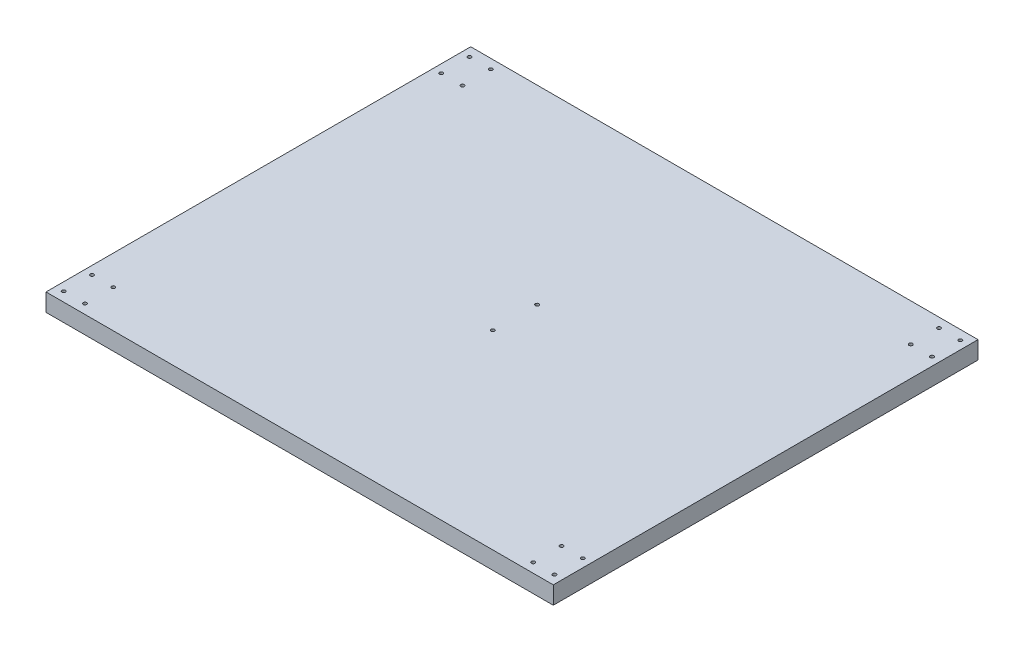
ISO-10303-21;
HEADER;
FILE_DESCRIPTION(('STEP AP214'),'2;1');
FILE_NAME('part.step','',(''),(''),'','','');
FILE_SCHEMA(('AUTOMOTIVE_DESIGN { 1 0 10303 214 1 1 1 1 }'));
ENDSEC;
DATA;
#1=APPLICATION_CONTEXT('core data for automotive mechanical design processes');
#2=APPLICATION_PROTOCOL_DEFINITION('international standard','automotive_design',2000,#1);
#3=PRODUCT_CONTEXT('',#1,'mechanical');
#4=PRODUCT('Part','Part','',(#3));
#5=PRODUCT_RELATED_PRODUCT_CATEGORY('part','',(#4));
#6=PRODUCT_DEFINITION_FORMATION('','',#4);
#7=PRODUCT_DEFINITION_CONTEXT('part definition',#1,'design');
#8=PRODUCT_DEFINITION('design','',#6,#7);
#9=PRODUCT_DEFINITION_SHAPE('','',#8);
#10=(LENGTH_UNIT() NAMED_UNIT(*) SI_UNIT(.MILLI.,.METRE.));
#11=(NAMED_UNIT(*) PLANE_ANGLE_UNIT() SI_UNIT($,.RADIAN.));
#12=(NAMED_UNIT(*) SI_UNIT($,.STERADIAN.) SOLID_ANGLE_UNIT());
#13=UNCERTAINTY_MEASURE_WITH_UNIT(LENGTH_MEASURE(1.E-05),#10,'distance_accuracy_value','');
#14=(GEOMETRIC_REPRESENTATION_CONTEXT(3) GLOBAL_UNCERTAINTY_ASSIGNED_CONTEXT((#13)) GLOBAL_UNIT_ASSIGNED_CONTEXT((#10,
#11,#12)) REPRESENTATION_CONTEXT('',''));
#15=CARTESIAN_POINT('',(0.,0.,0.));
#16=DIRECTION('',(0.,0.,1.));
#17=DIRECTION('',(1.,0.,0.));
#18=AXIS2_PLACEMENT_3D('',#15,#16,#17);
#19=CARTESIAN_POINT('',(0.,15.,0.));
#20=DIRECTION('',(0.,-1.,0.));
#21=DIRECTION('',(0.,0.,-1.));
#22=AXIS2_PLACEMENT_3D('',#19,#20,#21);
#23=PLANE('',#22);
#24=CARTESIAN_POINT('',(208.,15.,-148.));
#25=DIRECTION('',(0.,1.,0.));
#26=DIRECTION('',(0.,0.,-1.));
#27=AXIS2_PLACEMENT_3D('',#24,#25,#26);
#28=CIRCLE('',#27,1.5);
#29=CARTESIAN_POINT('',(208.,15.,-149.5));
#30=VERTEX_POINT('',#29);
#31=EDGE_CURVE('E214',#30,#30,#28,.T.);
#32=ORIENTED_EDGE('',*,*,#31,.F.);
#33=EDGE_LOOP('',(#32));
#34=FACE_BOUND('',#33,.T.);
#35=CARTESIAN_POINT('',(190.,15.,-148.));
#36=DIRECTION('',(0.,1.,0.));
#37=DIRECTION('',(0.,0.,-1.));
#38=AXIS2_PLACEMENT_3D('',#35,#36,#37);
#39=CIRCLE('',#38,1.5);
#40=CARTESIAN_POINT('',(190.,15.,-149.5));
#41=VERTEX_POINT('',#40);
#42=EDGE_CURVE('E208',#41,#41,#39,.T.);
#43=ORIENTED_EDGE('',*,*,#42,.F.);
#44=EDGE_LOOP('',(#43));
#45=FACE_BOUND('',#44,.T.);
#46=CARTESIAN_POINT('',(190.,15.,-172.));
#47=DIRECTION('',(0.,1.,0.));
#48=DIRECTION('',(0.,0.,-1.));
#49=AXIS2_PLACEMENT_3D('',#46,#47,#48);
#50=CIRCLE('',#49,1.5);
#51=CARTESIAN_POINT('',(190.,15.,-173.5));
#52=VERTEX_POINT('',#51);
#53=EDGE_CURVE('E202',#52,#52,#50,.T.);
#54=ORIENTED_EDGE('',*,*,#53,.F.);
#55=EDGE_LOOP('',(#54));
#56=FACE_BOUND('',#55,.T.);
#57=CARTESIAN_POINT('',(208.,15.,-172.));
#58=DIRECTION('',(0.,1.,0.));
#59=DIRECTION('',(0.,0.,-1.));
#60=AXIS2_PLACEMENT_3D('',#57,#58,#59);
#61=CIRCLE('',#60,1.5);
#62=CARTESIAN_POINT('',(208.,15.,-173.5));
#63=VERTEX_POINT('',#62);
#64=EDGE_CURVE('E196',#63,#63,#61,.T.);
#65=ORIENTED_EDGE('',*,*,#64,.F.);
#66=EDGE_LOOP('',(#65));
#67=FACE_BOUND('',#66,.T.);
#68=CARTESIAN_POINT('',(-208.,15.,-148.));
#69=DIRECTION('',(0.,1.,0.));
#70=DIRECTION('',(0.,0.,1.));
#71=AXIS2_PLACEMENT_3D('',#68,#69,#70);
#72=CIRCLE('',#71,1.5);
#73=CARTESIAN_POINT('',(-208.,15.,-146.5));
#74=VERTEX_POINT('',#73);
#75=EDGE_CURVE('E190',#74,#74,#72,.T.);
#76=ORIENTED_EDGE('',*,*,#75,.F.);
#77=EDGE_LOOP('',(#76));
#78=FACE_BOUND('',#77,.T.);
#79=CARTESIAN_POINT('',(-190.,15.,-148.));
#80=DIRECTION('',(0.,1.,0.));
#81=DIRECTION('',(0.,0.,1.));
#82=AXIS2_PLACEMENT_3D('',#79,#80,#81);
#83=CIRCLE('',#82,1.5);
#84=CARTESIAN_POINT('',(-190.,15.,-146.5));
#85=VERTEX_POINT('',#84);
#86=EDGE_CURVE('E184',#85,#85,#83,.T.);
#87=ORIENTED_EDGE('',*,*,#86,.F.);
#88=EDGE_LOOP('',(#87));
#89=FACE_BOUND('',#88,.T.);
#90=CARTESIAN_POINT('',(-190.,15.,-172.));
#91=DIRECTION('',(0.,1.,0.));
#92=DIRECTION('',(0.,0.,1.));
#93=AXIS2_PLACEMENT_3D('',#90,#91,#92);
#94=CIRCLE('',#93,1.5);
#95=CARTESIAN_POINT('',(-190.,15.,-170.5));
#96=VERTEX_POINT('',#95);
#97=EDGE_CURVE('E178',#96,#96,#94,.T.);
#98=ORIENTED_EDGE('',*,*,#97,.F.);
#99=EDGE_LOOP('',(#98));
#100=FACE_BOUND('',#99,.T.);
#101=CARTESIAN_POINT('',(-208.,15.,-172.));
#102=DIRECTION('',(0.,1.,0.));
#103=DIRECTION('',(0.,0.,1.));
#104=AXIS2_PLACEMENT_3D('',#101,#102,#103);
#105=CIRCLE('',#104,1.5);
#106=CARTESIAN_POINT('',(-208.,15.,-170.5));
#107=VERTEX_POINT('',#106);
#108=EDGE_CURVE('E172',#107,#107,#105,.T.);
#109=ORIENTED_EDGE('',*,*,#108,.F.);
#110=EDGE_LOOP('',(#109));
#111=FACE_BOUND('',#110,.T.);
#112=CARTESIAN_POINT('',(-190.,15.,148.));
#113=DIRECTION('',(0.,1.,0.));
#114=DIRECTION('',(0.,0.,-1.));
#115=AXIS2_PLACEMENT_3D('',#112,#113,#114);
#116=CIRCLE('',#115,1.5);
#117=CARTESIAN_POINT('',(-190.,15.,146.5));
#118=VERTEX_POINT('',#117);
#119=EDGE_CURVE('E166',#118,#118,#116,.T.);
#120=ORIENTED_EDGE('',*,*,#119,.F.);
#121=EDGE_LOOP('',(#120));
#122=FACE_BOUND('',#121,.T.);
#123=CARTESIAN_POINT('',(-208.,15.,148.));
#124=DIRECTION('',(0.,1.,0.));
#125=DIRECTION('',(0.,0.,-1.));
#126=AXIS2_PLACEMENT_3D('',#123,#124,#125);
#127=CIRCLE('',#126,1.5);
#128=CARTESIAN_POINT('',(-208.,15.,146.5));
#129=VERTEX_POINT('',#128);
#130=EDGE_CURVE('E160',#129,#129,#127,.T.);
#131=ORIENTED_EDGE('',*,*,#130,.F.);
#132=EDGE_LOOP('',(#131));
#133=FACE_BOUND('',#132,.T.);
#134=CARTESIAN_POINT('',(-190.,15.,172.));
#135=DIRECTION('',(0.,1.,0.));
#136=DIRECTION('',(0.,0.,-1.));
#137=AXIS2_PLACEMENT_3D('',#134,#135,#136);
#138=CIRCLE('',#137,1.5);
#139=CARTESIAN_POINT('',(-190.,15.,170.5));
#140=VERTEX_POINT('',#139);
#141=EDGE_CURVE('E154',#140,#140,#138,.T.);
#142=ORIENTED_EDGE('',*,*,#141,.F.);
#143=EDGE_LOOP('',(#142));
#144=FACE_BOUND('',#143,.T.);
#145=CARTESIAN_POINT('',(-208.,15.,172.));
#146=DIRECTION('',(0.,1.,0.));
#147=DIRECTION('',(0.,0.,-1.));
#148=AXIS2_PLACEMENT_3D('',#145,#146,#147);
#149=CIRCLE('',#148,1.5);
#150=CARTESIAN_POINT('',(-208.,15.,170.5));
#151=VERTEX_POINT('',#150);
#152=EDGE_CURVE('E148',#151,#151,#149,.T.);
#153=ORIENTED_EDGE('',*,*,#152,.F.);
#154=EDGE_LOOP('',(#153));
#155=FACE_BOUND('',#154,.T.);
#156=CARTESIAN_POINT('',(208.,15.,148.));
#157=DIRECTION('',(0.,1.,0.));
#158=DIRECTION('',(0.,0.,1.));
#159=AXIS2_PLACEMENT_3D('',#156,#157,#158);
#160=CIRCLE('',#159,1.5);
#161=CARTESIAN_POINT('',(208.,15.,149.5));
#162=VERTEX_POINT('',#161);
#163=EDGE_CURVE('E142',#162,#162,#160,.T.);
#164=ORIENTED_EDGE('',*,*,#163,.F.);
#165=EDGE_LOOP('',(#164));
#166=FACE_BOUND('',#165,.T.);
#167=CARTESIAN_POINT('',(190.,15.,148.));
#168=DIRECTION('',(0.,1.,0.));
#169=DIRECTION('',(0.,0.,1.));
#170=AXIS2_PLACEMENT_3D('',#167,#168,#169);
#171=CIRCLE('',#170,1.5);
#172=CARTESIAN_POINT('',(190.,15.,149.5));
#173=VERTEX_POINT('',#172);
#174=EDGE_CURVE('E136',#173,#173,#171,.T.);
#175=ORIENTED_EDGE('',*,*,#174,.F.);
#176=EDGE_LOOP('',(#175));
#177=FACE_BOUND('',#176,.T.);
#178=CARTESIAN_POINT('',(190.,15.,172.));
#179=DIRECTION('',(0.,1.,0.));
#180=DIRECTION('',(0.,0.,1.));
#181=AXIS2_PLACEMENT_3D('',#178,#179,#180);
#182=CIRCLE('',#181,1.5);
#183=CARTESIAN_POINT('',(190.,15.,173.5));
#184=VERTEX_POINT('',#183);
#185=EDGE_CURVE('E130',#184,#184,#182,.T.);
#186=ORIENTED_EDGE('',*,*,#185,.F.);
#187=EDGE_LOOP('',(#186));
#188=FACE_BOUND('',#187,.T.);
#189=CARTESIAN_POINT('',(208.,15.,172.));
#190=DIRECTION('',(0.,1.,0.));
#191=DIRECTION('',(0.,0.,1.));
#192=AXIS2_PLACEMENT_3D('',#189,#190,#191);
#193=CIRCLE('',#192,1.5);
#194=CARTESIAN_POINT('',(208.,15.,173.5));
#195=VERTEX_POINT('',#194);
#196=EDGE_CURVE('E124',#195,#195,#193,.T.);
#197=ORIENTED_EDGE('',*,*,#196,.F.);
#198=EDGE_LOOP('',(#197));
#199=FACE_BOUND('',#198,.T.);
#200=CARTESIAN_POINT('',(2.5,15.,-18.8));
#201=DIRECTION('',(0.,1.,0.));
#202=DIRECTION('',(0.,0.,1.));
#203=AXIS2_PLACEMENT_3D('',#200,#201,#202);
#204=CIRCLE('',#203,1.5);
#205=CARTESIAN_POINT('',(2.5,15.,-17.3));
#206=VERTEX_POINT('',#205);
#207=EDGE_CURVE('E100',#206,#206,#204,.T.);
#208=ORIENTED_EDGE('',*,*,#207,.F.);
#209=EDGE_LOOP('',(#208));
#210=FACE_BOUND('',#209,.T.);
#211=DIRECTION('',(0.,0.,-1.));
#212=VECTOR('',#211,1.);
#213=CARTESIAN_POINT('',(215.,15.,180.));
#214=LINE('',#213,#212);
#215=CARTESIAN_POINT('',(215.,15.,180.));
#216=VERTEX_POINT('',#215);
#217=CARTESIAN_POINT('',(215.,15.,-180.));
#218=VERTEX_POINT('',#217);
#219=EDGE_CURVE('E85',#216,#218,#214,.T.);
#220=ORIENTED_EDGE('',*,*,#219,.T.);
#221=DIRECTION('',(-1.,0.,0.));
#222=VECTOR('',#221,1.);
#223=CARTESIAN_POINT('',(-215.,15.,-180.));
#224=LINE('',#223,#222);
#225=CARTESIAN_POINT('',(-215.,15.,-180.));
#226=VERTEX_POINT('',#225);
#227=EDGE_CURVE('E80',#218,#226,#224,.T.);
#228=ORIENTED_EDGE('',*,*,#227,.T.);
#229=DIRECTION('',(0.,0.,1.));
#230=VECTOR('',#229,1.);
#231=CARTESIAN_POINT('',(-215.,15.,180.));
#232=LINE('',#231,#230);
#233=CARTESIAN_POINT('',(-215.,15.,180.));
#234=VERTEX_POINT('',#233);
#235=EDGE_CURVE('E83',#226,#234,#232,.T.);
#236=ORIENTED_EDGE('',*,*,#235,.T.);
#237=DIRECTION('',(1.,0.,0.));
#238=VECTOR('',#237,1.);
#239=CARTESIAN_POINT('',(-215.,15.,180.));
#240=LINE('',#239,#238);
#241=EDGE_CURVE('E50',#234,#216,#240,.T.);
#242=ORIENTED_EDGE('',*,*,#241,.T.);
#243=EDGE_LOOP('',(#220,#228,#236,#242));
#244=FACE_BOUND('',#243,.T.);
#245=CARTESIAN_POINT('',(2.5,15.,18.8));
#246=DIRECTION('',(0.,1.,0.));
#247=DIRECTION('',(0.,0.,1.));
#248=AXIS2_PLACEMENT_3D('',#245,#246,#247);
#249=CIRCLE('',#248,1.5);
#250=CARTESIAN_POINT('',(2.5,15.,20.3));
#251=VERTEX_POINT('',#250);
#252=EDGE_CURVE('E115',#251,#251,#249,.T.);
#253=ORIENTED_EDGE('',*,*,#252,.F.);
#254=EDGE_LOOP('',(#253));
#255=FACE_BOUND('',#254,.T.);
#256=ADVANCED_FACE('F33',(#34,#45,#56,#67,#78,#89,#100,#111,#122,#133,#144,#155,#166,#177,#188,
#199,#210,#244,#255),#23,.F.);
#257=CARTESIAN_POINT('',(0.,0.,0.));
#258=DIRECTION('',(0.,-1.,0.));
#259=DIRECTION('',(0.,0.,-1.));
#260=AXIS2_PLACEMENT_3D('',#257,#258,#259);
#261=PLANE('',#260);
#262=CARTESIAN_POINT('',(208.,0.,-148.));
#263=DIRECTION('',(0.,1.,0.));
#264=DIRECTION('',(0.,0.,-1.));
#265=AXIS2_PLACEMENT_3D('',#262,#263,#264);
#266=CIRCLE('',#265,1.5);
#267=CARTESIAN_POINT('',(208.,0.,-149.5));
#268=VERTEX_POINT('',#267);
#269=EDGE_CURVE('E211',#268,#268,#266,.T.);
#270=ORIENTED_EDGE('',*,*,#269,.T.);
#271=EDGE_LOOP('',(#270));
#272=FACE_BOUND('',#271,.T.);
#273=CARTESIAN_POINT('',(190.,0.,-148.));
#274=DIRECTION('',(0.,1.,0.));
#275=DIRECTION('',(0.,0.,-1.));
#276=AXIS2_PLACEMENT_3D('',#273,#274,#275);
#277=CIRCLE('',#276,1.5);
#278=CARTESIAN_POINT('',(190.,0.,-149.5));
#279=VERTEX_POINT('',#278);
#280=EDGE_CURVE('E205',#279,#279,#277,.T.);
#281=ORIENTED_EDGE('',*,*,#280,.T.);
#282=EDGE_LOOP('',(#281));
#283=FACE_BOUND('',#282,.T.);
#284=CARTESIAN_POINT('',(190.,0.,-172.));
#285=DIRECTION('',(0.,1.,0.));
#286=DIRECTION('',(0.,0.,-1.));
#287=AXIS2_PLACEMENT_3D('',#284,#285,#286);
#288=CIRCLE('',#287,1.5);
#289=CARTESIAN_POINT('',(190.,0.,-173.5));
#290=VERTEX_POINT('',#289);
#291=EDGE_CURVE('E199',#290,#290,#288,.T.);
#292=ORIENTED_EDGE('',*,*,#291,.T.);
#293=EDGE_LOOP('',(#292));
#294=FACE_BOUND('',#293,.T.);
#295=CARTESIAN_POINT('',(208.,0.,-172.));
#296=DIRECTION('',(0.,1.,0.));
#297=DIRECTION('',(0.,0.,-1.));
#298=AXIS2_PLACEMENT_3D('',#295,#296,#297);
#299=CIRCLE('',#298,1.5);
#300=CARTESIAN_POINT('',(208.,0.,-173.5));
#301=VERTEX_POINT('',#300);
#302=EDGE_CURVE('E193',#301,#301,#299,.T.);
#303=ORIENTED_EDGE('',*,*,#302,.T.);
#304=EDGE_LOOP('',(#303));
#305=FACE_BOUND('',#304,.T.);
#306=CARTESIAN_POINT('',(-208.,0.,-148.));
#307=DIRECTION('',(0.,1.,0.));
#308=DIRECTION('',(0.,0.,1.));
#309=AXIS2_PLACEMENT_3D('',#306,#307,#308);
#310=CIRCLE('',#309,1.5);
#311=CARTESIAN_POINT('',(-208.,0.,-146.5));
#312=VERTEX_POINT('',#311);
#313=EDGE_CURVE('E187',#312,#312,#310,.T.);
#314=ORIENTED_EDGE('',*,*,#313,.T.);
#315=EDGE_LOOP('',(#314));
#316=FACE_BOUND('',#315,.T.);
#317=CARTESIAN_POINT('',(-190.,0.,-148.));
#318=DIRECTION('',(0.,1.,0.));
#319=DIRECTION('',(0.,0.,1.));
#320=AXIS2_PLACEMENT_3D('',#317,#318,#319);
#321=CIRCLE('',#320,1.5);
#322=CARTESIAN_POINT('',(-190.,0.,-146.5));
#323=VERTEX_POINT('',#322);
#324=EDGE_CURVE('E181',#323,#323,#321,.T.);
#325=ORIENTED_EDGE('',*,*,#324,.T.);
#326=EDGE_LOOP('',(#325));
#327=FACE_BOUND('',#326,.T.);
#328=CARTESIAN_POINT('',(-190.,0.,-172.));
#329=DIRECTION('',(0.,1.,0.));
#330=DIRECTION('',(0.,0.,1.));
#331=AXIS2_PLACEMENT_3D('',#328,#329,#330);
#332=CIRCLE('',#331,1.5);
#333=CARTESIAN_POINT('',(-190.,0.,-170.5));
#334=VERTEX_POINT('',#333);
#335=EDGE_CURVE('E175',#334,#334,#332,.T.);
#336=ORIENTED_EDGE('',*,*,#335,.T.);
#337=EDGE_LOOP('',(#336));
#338=FACE_BOUND('',#337,.T.);
#339=CARTESIAN_POINT('',(-208.,0.,-172.));
#340=DIRECTION('',(0.,1.,0.));
#341=DIRECTION('',(0.,0.,1.));
#342=AXIS2_PLACEMENT_3D('',#339,#340,#341);
#343=CIRCLE('',#342,1.5);
#344=CARTESIAN_POINT('',(-208.,0.,-170.5));
#345=VERTEX_POINT('',#344);
#346=EDGE_CURVE('E169',#345,#345,#343,.T.);
#347=ORIENTED_EDGE('',*,*,#346,.T.);
#348=EDGE_LOOP('',(#347));
#349=FACE_BOUND('',#348,.T.);
#350=CARTESIAN_POINT('',(-190.,0.,148.));
#351=DIRECTION('',(0.,1.,0.));
#352=DIRECTION('',(0.,0.,-1.));
#353=AXIS2_PLACEMENT_3D('',#350,#351,#352);
#354=CIRCLE('',#353,1.5);
#355=CARTESIAN_POINT('',(-190.,0.,146.5));
#356=VERTEX_POINT('',#355);
#357=EDGE_CURVE('E163',#356,#356,#354,.T.);
#358=ORIENTED_EDGE('',*,*,#357,.T.);
#359=EDGE_LOOP('',(#358));
#360=FACE_BOUND('',#359,.T.);
#361=CARTESIAN_POINT('',(-208.,0.,148.));
#362=DIRECTION('',(0.,1.,0.));
#363=DIRECTION('',(0.,0.,-1.));
#364=AXIS2_PLACEMENT_3D('',#361,#362,#363);
#365=CIRCLE('',#364,1.5);
#366=CARTESIAN_POINT('',(-208.,0.,146.5));
#367=VERTEX_POINT('',#366);
#368=EDGE_CURVE('E157',#367,#367,#365,.T.);
#369=ORIENTED_EDGE('',*,*,#368,.T.);
#370=EDGE_LOOP('',(#369));
#371=FACE_BOUND('',#370,.T.);
#372=CARTESIAN_POINT('',(-190.,0.,172.));
#373=DIRECTION('',(0.,1.,0.));
#374=DIRECTION('',(0.,0.,-1.));
#375=AXIS2_PLACEMENT_3D('',#372,#373,#374);
#376=CIRCLE('',#375,1.5);
#377=CARTESIAN_POINT('',(-190.,0.,170.5));
#378=VERTEX_POINT('',#377);
#379=EDGE_CURVE('E151',#378,#378,#376,.T.);
#380=ORIENTED_EDGE('',*,*,#379,.T.);
#381=EDGE_LOOP('',(#380));
#382=FACE_BOUND('',#381,.T.);
#383=CARTESIAN_POINT('',(-208.,0.,172.));
#384=DIRECTION('',(0.,1.,0.));
#385=DIRECTION('',(0.,0.,-1.));
#386=AXIS2_PLACEMENT_3D('',#383,#384,#385);
#387=CIRCLE('',#386,1.5);
#388=CARTESIAN_POINT('',(-208.,0.,170.5));
#389=VERTEX_POINT('',#388);
#390=EDGE_CURVE('E145',#389,#389,#387,.T.);
#391=ORIENTED_EDGE('',*,*,#390,.T.);
#392=EDGE_LOOP('',(#391));
#393=FACE_BOUND('',#392,.T.);
#394=CARTESIAN_POINT('',(208.,0.,148.));
#395=DIRECTION('',(0.,1.,0.));
#396=DIRECTION('',(0.,0.,1.));
#397=AXIS2_PLACEMENT_3D('',#394,#395,#396);
#398=CIRCLE('',#397,1.5);
#399=CARTESIAN_POINT('',(208.,0.,149.5));
#400=VERTEX_POINT('',#399);
#401=EDGE_CURVE('E139',#400,#400,#398,.T.);
#402=ORIENTED_EDGE('',*,*,#401,.T.);
#403=EDGE_LOOP('',(#402));
#404=FACE_BOUND('',#403,.T.);
#405=CARTESIAN_POINT('',(190.,0.,148.));
#406=DIRECTION('',(0.,1.,0.));
#407=DIRECTION('',(0.,0.,1.));
#408=AXIS2_PLACEMENT_3D('',#405,#406,#407);
#409=CIRCLE('',#408,1.5);
#410=CARTESIAN_POINT('',(190.,0.,149.5));
#411=VERTEX_POINT('',#410);
#412=EDGE_CURVE('E133',#411,#411,#409,.T.);
#413=ORIENTED_EDGE('',*,*,#412,.T.);
#414=EDGE_LOOP('',(#413));
#415=FACE_BOUND('',#414,.T.);
#416=CARTESIAN_POINT('',(190.,0.,172.));
#417=DIRECTION('',(0.,1.,0.));
#418=DIRECTION('',(0.,0.,1.));
#419=AXIS2_PLACEMENT_3D('',#416,#417,#418);
#420=CIRCLE('',#419,1.5);
#421=CARTESIAN_POINT('',(190.,0.,173.5));
#422=VERTEX_POINT('',#421);
#423=EDGE_CURVE('E127',#422,#422,#420,.T.);
#424=ORIENTED_EDGE('',*,*,#423,.T.);
#425=EDGE_LOOP('',(#424));
#426=FACE_BOUND('',#425,.T.);
#427=CARTESIAN_POINT('',(208.,0.,172.));
#428=DIRECTION('',(0.,1.,0.));
#429=DIRECTION('',(0.,0.,1.));
#430=AXIS2_PLACEMENT_3D('',#427,#428,#429);
#431=CIRCLE('',#430,1.5);
#432=CARTESIAN_POINT('',(208.,0.,173.5));
#433=VERTEX_POINT('',#432);
#434=EDGE_CURVE('E121',#433,#433,#431,.T.);
#435=ORIENTED_EDGE('',*,*,#434,.T.);
#436=EDGE_LOOP('',(#435));
#437=FACE_BOUND('',#436,.T.);
#438=CARTESIAN_POINT('',(2.5,0.,-18.8));
#439=DIRECTION('',(0.,1.,0.));
#440=DIRECTION('',(0.,0.,1.));
#441=AXIS2_PLACEMENT_3D('',#438,#439,#440);
#442=CIRCLE('',#441,1.5);
#443=CARTESIAN_POINT('',(2.5,0.,-17.3));
#444=VERTEX_POINT('',#443);
#445=EDGE_CURVE('E112',#444,#444,#442,.T.);
#446=ORIENTED_EDGE('',*,*,#445,.T.);
#447=EDGE_LOOP('',(#446));
#448=FACE_BOUND('',#447,.T.);
#449=DIRECTION('',(0.,0.,-1.));
#450=VECTOR('',#449,1.);
#451=CARTESIAN_POINT('',(215.,0.,180.));
#452=LINE('',#451,#450);
#453=CARTESIAN_POINT('',(215.,0.,180.));
#454=VERTEX_POINT('',#453);
#455=CARTESIAN_POINT('',(215.,0.,-180.));
#456=VERTEX_POINT('',#455);
#457=EDGE_CURVE('E97',#454,#456,#452,.T.);
#458=ORIENTED_EDGE('',*,*,#457,.F.);
#459=DIRECTION('',(1.,0.,0.));
#460=VECTOR('',#459,1.);
#461=CARTESIAN_POINT('',(-215.,0.,180.));
#462=LINE('',#461,#460);
#463=CARTESIAN_POINT('',(-215.,0.,180.));
#464=VERTEX_POINT('',#463);
#465=EDGE_CURVE('E73',#464,#454,#462,.T.);
#466=ORIENTED_EDGE('',*,*,#465,.F.);
#467=DIRECTION('',(0.,0.,1.));
#468=VECTOR('',#467,1.);
#469=CARTESIAN_POINT('',(-215.,0.,180.));
#470=LINE('',#469,#468);
#471=CARTESIAN_POINT('',(-215.,0.,-180.));
#472=VERTEX_POINT('',#471);
#473=EDGE_CURVE('E67',#472,#464,#470,.T.);
#474=ORIENTED_EDGE('',*,*,#473,.F.);
#475=DIRECTION('',(-1.,0.,0.));
#476=VECTOR('',#475,1.);
#477=CARTESIAN_POINT('',(-215.,0.,-180.));
#478=LINE('',#477,#476);
#479=EDGE_CURVE('E89',#456,#472,#478,.T.);
#480=ORIENTED_EDGE('',*,*,#479,.F.);
#481=EDGE_LOOP('',(#458,#466,#474,#480));
#482=FACE_BOUND('',#481,.T.);
#483=CARTESIAN_POINT('',(2.5,0.,18.8));
#484=DIRECTION('',(0.,1.,0.));
#485=DIRECTION('',(0.,0.,1.));
#486=AXIS2_PLACEMENT_3D('',#483,#484,#485);
#487=CIRCLE('',#486,1.5);
#488=CARTESIAN_POINT('',(2.5,0.,20.3));
#489=VERTEX_POINT('',#488);
#490=EDGE_CURVE('E118',#489,#489,#487,.T.);
#491=ORIENTED_EDGE('',*,*,#490,.T.);
#492=EDGE_LOOP('',(#491));
#493=FACE_BOUND('',#492,.T.);
#494=ADVANCED_FACE('F108',(#272,#283,#294,#305,#316,#327,#338,#349,#360,#371,#382,#393,#404,
#415,#426,#437,#448,#482,#493),#261,.T.);
#495=CARTESIAN_POINT('',(215.,15.,180.));
#496=DIRECTION('',(-1.,0.,0.));
#497=DIRECTION('',(0.,0.,1.));
#498=AXIS2_PLACEMENT_3D('',#495,#496,#497);
#499=PLANE('',#498);
#500=ORIENTED_EDGE('',*,*,#457,.T.);
#501=DIRECTION('',(0.,-1.,0.));
#502=VECTOR('',#501,1.);
#503=CARTESIAN_POINT('',(215.,15.,-180.));
#504=LINE('',#503,#502);
#505=EDGE_CURVE('E11',#218,#456,#504,.T.);
#506=ORIENTED_EDGE('',*,*,#505,.F.);
#507=ORIENTED_EDGE('',*,*,#219,.F.);
#508=DIRECTION('',(0.,-1.,0.));
#509=VECTOR('',#508,1.);
#510=CARTESIAN_POINT('',(215.,15.,180.));
#511=LINE('',#510,#509);
#512=EDGE_CURVE('E93',#216,#454,#511,.T.);
#513=ORIENTED_EDGE('',*,*,#512,.T.);
#514=EDGE_LOOP('',(#500,#506,#507,#513));
#515=FACE_BOUND('',#514,.T.);
#516=ADVANCED_FACE('F35',(#515),#499,.F.);
#517=CARTESIAN_POINT('',(-215.,15.,-180.));
#518=DIRECTION('',(0.,0.,1.));
#519=DIRECTION('',(1.,0.,0.));
#520=AXIS2_PLACEMENT_3D('',#517,#518,#519);
#521=PLANE('',#520);
#522=ORIENTED_EDGE('',*,*,#479,.T.);
#523=DIRECTION('',(0.,-1.,0.));
#524=VECTOR('',#523,1.);
#525=CARTESIAN_POINT('',(-215.,15.,-180.));
#526=LINE('',#525,#524);
#527=EDGE_CURVE('E42',#226,#472,#526,.T.);
#528=ORIENTED_EDGE('',*,*,#527,.F.);
#529=ORIENTED_EDGE('',*,*,#227,.F.);
#530=ORIENTED_EDGE('',*,*,#505,.T.);
#531=EDGE_LOOP('',(#522,#528,#529,#530));
#532=FACE_BOUND('',#531,.T.);
#533=ADVANCED_FACE('F88',(#532),#521,.F.);
#534=CARTESIAN_POINT('',(-215.,15.,180.));
#535=DIRECTION('',(1.,0.,0.));
#536=DIRECTION('',(0.,0.,-1.));
#537=AXIS2_PLACEMENT_3D('',#534,#535,#536);
#538=PLANE('',#537);
#539=ORIENTED_EDGE('',*,*,#473,.T.);
#540=DIRECTION('',(0.,-1.,0.));
#541=VECTOR('',#540,1.);
#542=CARTESIAN_POINT('',(-215.,15.,180.));
#543=LINE('',#542,#541);
#544=EDGE_CURVE('E90',#234,#464,#543,.T.);
#545=ORIENTED_EDGE('',*,*,#544,.F.);
#546=ORIENTED_EDGE('',*,*,#235,.F.);
#547=ORIENTED_EDGE('',*,*,#527,.T.);
#548=EDGE_LOOP('',(#539,#545,#546,#547));
#549=FACE_BOUND('',#548,.T.);
#550=ADVANCED_FACE('F91',(#549),#538,.F.);
#551=CARTESIAN_POINT('',(-215.,15.,180.));
#552=DIRECTION('',(0.,0.,-1.));
#553=DIRECTION('',(-1.,0.,0.));
#554=AXIS2_PLACEMENT_3D('',#551,#552,#553);
#555=PLANE('',#554);
#556=ORIENTED_EDGE('',*,*,#465,.T.);
#557=ORIENTED_EDGE('',*,*,#512,.F.);
#558=ORIENTED_EDGE('',*,*,#241,.F.);
#559=ORIENTED_EDGE('',*,*,#544,.T.);
#560=EDGE_LOOP('',(#556,#557,#558,#559));
#561=FACE_BOUND('',#560,.T.);
#562=ADVANCED_FACE('F105',(#561),#555,.F.);
#563=CARTESIAN_POINT('',(2.5,15.,-18.8));
#564=DIRECTION('',(0.,-1.,0.));
#565=DIRECTION('',(0.,0.,-1.));
#566=AXIS2_PLACEMENT_3D('',#563,#564,#565);
#567=CYLINDRICAL_SURFACE('',#566,1.5);
#568=ORIENTED_EDGE('',*,*,#207,.T.);
#569=EDGE_LOOP('',(#568));
#570=FACE_BOUND('',#569,.T.);
#571=ORIENTED_EDGE('',*,*,#445,.F.);
#572=EDGE_LOOP('',(#571));
#573=FACE_BOUND('',#572,.T.);
#574=ADVANCED_FACE('F264',(#570,#573),#567,.F.);
#575=CARTESIAN_POINT('',(2.5,15.,18.8));
#576=DIRECTION('',(0.,-1.,0.));
#577=DIRECTION('',(0.,0.,-1.));
#578=AXIS2_PLACEMENT_3D('',#575,#576,#577);
#579=CYLINDRICAL_SURFACE('',#578,1.5);
#580=ORIENTED_EDGE('',*,*,#252,.T.);
#581=EDGE_LOOP('',(#580));
#582=FACE_BOUND('',#581,.T.);
#583=ORIENTED_EDGE('',*,*,#490,.F.);
#584=EDGE_LOOP('',(#583));
#585=FACE_BOUND('',#584,.T.);
#586=ADVANCED_FACE('F267',(#582,#585),#579,.F.);
#587=CARTESIAN_POINT('',(208.,0.,172.));
#588=DIRECTION('',(0.,1.,0.));
#589=DIRECTION('',(0.,0.,1.));
#590=AXIS2_PLACEMENT_3D('',#587,#588,#589);
#591=CYLINDRICAL_SURFACE('',#590,1.5);
#592=ORIENTED_EDGE('',*,*,#434,.F.);
#593=EDGE_LOOP('',(#592));
#594=FACE_BOUND('',#593,.T.);
#595=ORIENTED_EDGE('',*,*,#196,.T.);
#596=EDGE_LOOP('',(#595));
#597=FACE_BOUND('',#596,.T.);
#598=ADVANCED_FACE('F303',(#594,#597),#591,.F.);
#599=CARTESIAN_POINT('',(190.,0.,172.));
#600=DIRECTION('',(0.,1.,0.));
#601=DIRECTION('',(0.,0.,1.));
#602=AXIS2_PLACEMENT_3D('',#599,#600,#601);
#603=CYLINDRICAL_SURFACE('',#602,1.5);
#604=ORIENTED_EDGE('',*,*,#423,.F.);
#605=EDGE_LOOP('',(#604));
#606=FACE_BOUND('',#605,.T.);
#607=ORIENTED_EDGE('',*,*,#185,.T.);
#608=EDGE_LOOP('',(#607));
#609=FACE_BOUND('',#608,.T.);
#610=ADVANCED_FACE('F312',(#606,#609),#603,.F.);
#611=CARTESIAN_POINT('',(190.,0.,148.));
#612=DIRECTION('',(0.,1.,0.));
#613=DIRECTION('',(0.,0.,1.));
#614=AXIS2_PLACEMENT_3D('',#611,#612,#613);
#615=CYLINDRICAL_SURFACE('',#614,1.5);
#616=ORIENTED_EDGE('',*,*,#412,.F.);
#617=EDGE_LOOP('',(#616));
#618=FACE_BOUND('',#617,.T.);
#619=ORIENTED_EDGE('',*,*,#174,.T.);
#620=EDGE_LOOP('',(#619));
#621=FACE_BOUND('',#620,.T.);
#622=ADVANCED_FACE('F320',(#618,#621),#615,.F.);
#623=CARTESIAN_POINT('',(208.,0.,148.));
#624=DIRECTION('',(0.,1.,0.));
#625=DIRECTION('',(0.,0.,1.));
#626=AXIS2_PLACEMENT_3D('',#623,#624,#625);
#627=CYLINDRICAL_SURFACE('',#626,1.5);
#628=ORIENTED_EDGE('',*,*,#401,.F.);
#629=EDGE_LOOP('',(#628));
#630=FACE_BOUND('',#629,.T.);
#631=ORIENTED_EDGE('',*,*,#163,.T.);
#632=EDGE_LOOP('',(#631));
#633=FACE_BOUND('',#632,.T.);
#634=ADVANCED_FACE('F328',(#630,#633),#627,.F.);
#635=CARTESIAN_POINT('',(-208.,0.,172.));
#636=DIRECTION('',(0.,1.,0.));
#637=DIRECTION('',(0.,0.,1.));
#638=AXIS2_PLACEMENT_3D('',#635,#636,#637);
#639=CYLINDRICAL_SURFACE('',#638,1.5);
#640=ORIENTED_EDGE('',*,*,#390,.F.);
#641=EDGE_LOOP('',(#640));
#642=FACE_BOUND('',#641,.T.);
#643=ORIENTED_EDGE('',*,*,#152,.T.);
#644=EDGE_LOOP('',(#643));
#645=FACE_BOUND('',#644,.T.);
#646=ADVANCED_FACE('F336',(#642,#645),#639,.F.);
#647=CARTESIAN_POINT('',(-190.,0.,172.));
#648=DIRECTION('',(0.,1.,0.));
#649=DIRECTION('',(0.,0.,1.));
#650=AXIS2_PLACEMENT_3D('',#647,#648,#649);
#651=CYLINDRICAL_SURFACE('',#650,1.5);
#652=ORIENTED_EDGE('',*,*,#379,.F.);
#653=EDGE_LOOP('',(#652));
#654=FACE_BOUND('',#653,.T.);
#655=ORIENTED_EDGE('',*,*,#141,.T.);
#656=EDGE_LOOP('',(#655));
#657=FACE_BOUND('',#656,.T.);
#658=ADVANCED_FACE('F344',(#654,#657),#651,.F.);
#659=CARTESIAN_POINT('',(-208.,0.,148.));
#660=DIRECTION('',(0.,1.,0.));
#661=DIRECTION('',(0.,0.,1.));
#662=AXIS2_PLACEMENT_3D('',#659,#660,#661);
#663=CYLINDRICAL_SURFACE('',#662,1.5);
#664=ORIENTED_EDGE('',*,*,#368,.F.);
#665=EDGE_LOOP('',(#664));
#666=FACE_BOUND('',#665,.T.);
#667=ORIENTED_EDGE('',*,*,#130,.T.);
#668=EDGE_LOOP('',(#667));
#669=FACE_BOUND('',#668,.T.);
#670=ADVANCED_FACE('F352',(#666,#669),#663,.F.);
#671=CARTESIAN_POINT('',(-190.,0.,148.));
#672=DIRECTION('',(0.,1.,0.));
#673=DIRECTION('',(0.,0.,1.));
#674=AXIS2_PLACEMENT_3D('',#671,#672,#673);
#675=CYLINDRICAL_SURFACE('',#674,1.5);
#676=ORIENTED_EDGE('',*,*,#357,.F.);
#677=EDGE_LOOP('',(#676));
#678=FACE_BOUND('',#677,.T.);
#679=ORIENTED_EDGE('',*,*,#119,.T.);
#680=EDGE_LOOP('',(#679));
#681=FACE_BOUND('',#680,.T.);
#682=ADVANCED_FACE('F360',(#678,#681),#675,.F.);
#683=CARTESIAN_POINT('',(-208.,0.,-172.));
#684=DIRECTION('',(0.,1.,0.));
#685=DIRECTION('',(0.,0.,1.));
#686=AXIS2_PLACEMENT_3D('',#683,#684,#685);
#687=CYLINDRICAL_SURFACE('',#686,1.5);
#688=ORIENTED_EDGE('',*,*,#346,.F.);
#689=EDGE_LOOP('',(#688));
#690=FACE_BOUND('',#689,.T.);
#691=ORIENTED_EDGE('',*,*,#108,.T.);
#692=EDGE_LOOP('',(#691));
#693=FACE_BOUND('',#692,.T.);
#694=ADVANCED_FACE('F368',(#690,#693),#687,.F.);
#695=CARTESIAN_POINT('',(-190.,0.,-172.));
#696=DIRECTION('',(0.,1.,0.));
#697=DIRECTION('',(0.,0.,1.));
#698=AXIS2_PLACEMENT_3D('',#695,#696,#697);
#699=CYLINDRICAL_SURFACE('',#698,1.5);
#700=ORIENTED_EDGE('',*,*,#335,.F.);
#701=EDGE_LOOP('',(#700));
#702=FACE_BOUND('',#701,.T.);
#703=ORIENTED_EDGE('',*,*,#97,.T.);
#704=EDGE_LOOP('',(#703));
#705=FACE_BOUND('',#704,.T.);
#706=ADVANCED_FACE('F376',(#702,#705),#699,.F.);
#707=CARTESIAN_POINT('',(-190.,0.,-148.));
#708=DIRECTION('',(0.,1.,0.));
#709=DIRECTION('',(0.,0.,1.));
#710=AXIS2_PLACEMENT_3D('',#707,#708,#709);
#711=CYLINDRICAL_SURFACE('',#710,1.5);
#712=ORIENTED_EDGE('',*,*,#324,.F.);
#713=EDGE_LOOP('',(#712));
#714=FACE_BOUND('',#713,.T.);
#715=ORIENTED_EDGE('',*,*,#86,.T.);
#716=EDGE_LOOP('',(#715));
#717=FACE_BOUND('',#716,.T.);
#718=ADVANCED_FACE('F384',(#714,#717),#711,.F.);
#719=CARTESIAN_POINT('',(-208.,0.,-148.));
#720=DIRECTION('',(0.,1.,0.));
#721=DIRECTION('',(0.,0.,1.));
#722=AXIS2_PLACEMENT_3D('',#719,#720,#721);
#723=CYLINDRICAL_SURFACE('',#722,1.5);
#724=ORIENTED_EDGE('',*,*,#313,.F.);
#725=EDGE_LOOP('',(#724));
#726=FACE_BOUND('',#725,.T.);
#727=ORIENTED_EDGE('',*,*,#75,.T.);
#728=EDGE_LOOP('',(#727));
#729=FACE_BOUND('',#728,.T.);
#730=ADVANCED_FACE('F392',(#726,#729),#723,.F.);
#731=CARTESIAN_POINT('',(208.,0.,-172.));
#732=DIRECTION('',(0.,1.,0.));
#733=DIRECTION('',(0.,0.,1.));
#734=AXIS2_PLACEMENT_3D('',#731,#732,#733);
#735=CYLINDRICAL_SURFACE('',#734,1.5);
#736=ORIENTED_EDGE('',*,*,#302,.F.);
#737=EDGE_LOOP('',(#736));
#738=FACE_BOUND('',#737,.T.);
#739=ORIENTED_EDGE('',*,*,#64,.T.);
#740=EDGE_LOOP('',(#739));
#741=FACE_BOUND('',#740,.T.);
#742=ADVANCED_FACE('F400',(#738,#741),#735,.F.);
#743=CARTESIAN_POINT('',(190.,0.,-172.));
#744=DIRECTION('',(0.,1.,0.));
#745=DIRECTION('',(0.,0.,1.));
#746=AXIS2_PLACEMENT_3D('',#743,#744,#745);
#747=CYLINDRICAL_SURFACE('',#746,1.5);
#748=ORIENTED_EDGE('',*,*,#291,.F.);
#749=EDGE_LOOP('',(#748));
#750=FACE_BOUND('',#749,.T.);
#751=ORIENTED_EDGE('',*,*,#53,.T.);
#752=EDGE_LOOP('',(#751));
#753=FACE_BOUND('',#752,.T.);
#754=ADVANCED_FACE('F408',(#750,#753),#747,.F.);
#755=CARTESIAN_POINT('',(190.,0.,-148.));
#756=DIRECTION('',(0.,1.,0.));
#757=DIRECTION('',(0.,0.,1.));
#758=AXIS2_PLACEMENT_3D('',#755,#756,#757);
#759=CYLINDRICAL_SURFACE('',#758,1.5);
#760=ORIENTED_EDGE('',*,*,#280,.F.);
#761=EDGE_LOOP('',(#760));
#762=FACE_BOUND('',#761,.T.);
#763=ORIENTED_EDGE('',*,*,#42,.T.);
#764=EDGE_LOOP('',(#763));
#765=FACE_BOUND('',#764,.T.);
#766=ADVANCED_FACE('F225',(#762,#765),#759,.F.);
#767=CARTESIAN_POINT('',(208.,0.,-148.));
#768=DIRECTION('',(0.,1.,0.));
#769=DIRECTION('',(0.,0.,1.));
#770=AXIS2_PLACEMENT_3D('',#767,#768,#769);
#771=CYLINDRICAL_SURFACE('',#770,1.5);
#772=ORIENTED_EDGE('',*,*,#269,.F.);
#773=EDGE_LOOP('',(#772));
#774=FACE_BOUND('',#773,.T.);
#775=ORIENTED_EDGE('',*,*,#31,.T.);
#776=EDGE_LOOP('',(#775));
#777=FACE_BOUND('',#776,.T.);
#778=ADVANCED_FACE('F222',(#774,#777),#771,.F.);
#779=CLOSED_SHELL('',(#256,#494,#516,#533,#550,#562,#574,#586,#598,#610,#622,#634,#646,#658,
#670,#682,#694,#706,#718,#730,#742,#754,#766,#778));
#780=MANIFOLD_SOLID_BREP('B2',#779);
#781=ADVANCED_BREP_SHAPE_REPRESENTATION('',(#18,#780),#14);
#782=SHAPE_DEFINITION_REPRESENTATION(#9,#781);
ENDSEC;
END-ISO-10303-21;
